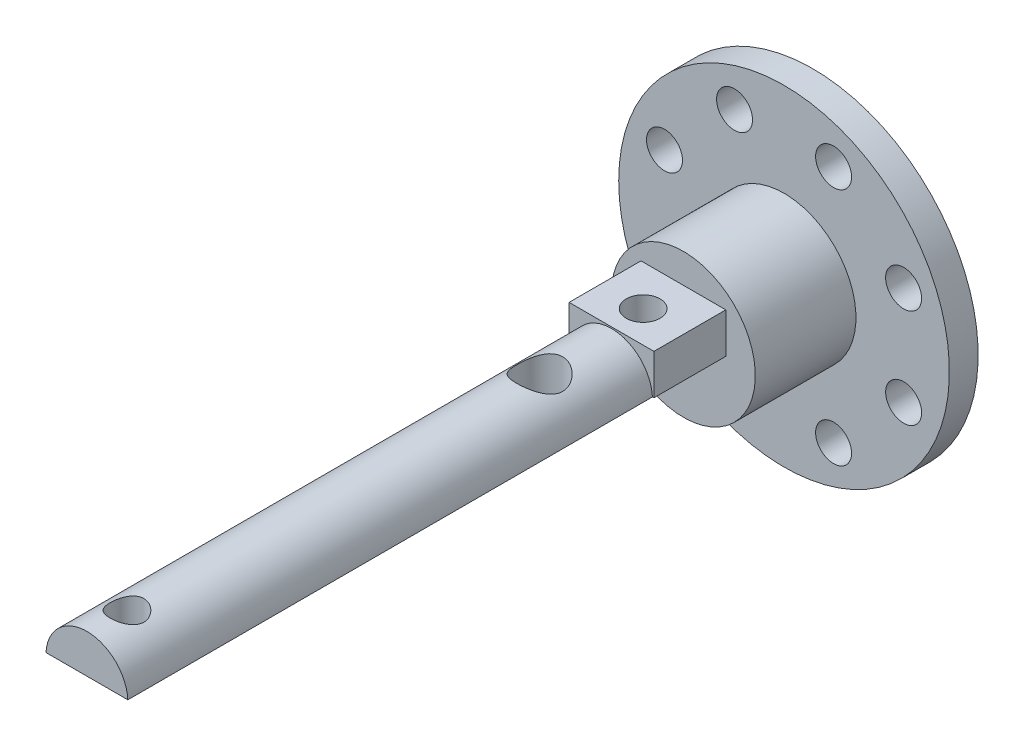
ISO-10303-21;
HEADER;
FILE_DESCRIPTION(('STEP AP214'),'2;1');
FILE_NAME('part.step','',(''),(''),'','','');
FILE_SCHEMA(('AUTOMOTIVE_DESIGN { 1 0 10303 214 1 1 1 1 }'));
ENDSEC;
DATA;
#1=APPLICATION_CONTEXT('core data for automotive mechanical design processes');
#2=APPLICATION_PROTOCOL_DEFINITION('international standard','automotive_design',2000,#1);
#3=PRODUCT_CONTEXT('',#1,'mechanical');
#4=PRODUCT('Part','Part','',(#3));
#5=PRODUCT_RELATED_PRODUCT_CATEGORY('part','',(#4));
#6=PRODUCT_DEFINITION_FORMATION('','',#4);
#7=PRODUCT_DEFINITION_CONTEXT('part definition',#1,'design');
#8=PRODUCT_DEFINITION('design','',#6,#7);
#9=PRODUCT_DEFINITION_SHAPE('','',#8);
#10=(LENGTH_UNIT() NAMED_UNIT(*) SI_UNIT(.MILLI.,.METRE.));
#11=(NAMED_UNIT(*) PLANE_ANGLE_UNIT() SI_UNIT($,.RADIAN.));
#12=(NAMED_UNIT(*) SI_UNIT($,.STERADIAN.) SOLID_ANGLE_UNIT());
#13=UNCERTAINTY_MEASURE_WITH_UNIT(LENGTH_MEASURE(1.E-05),#10,'distance_accuracy_value','');
#14=(GEOMETRIC_REPRESENTATION_CONTEXT(3) GLOBAL_UNCERTAINTY_ASSIGNED_CONTEXT((#13)) GLOBAL_UNIT_ASSIGNED_CONTEXT((#10,
#11,#12)) REPRESENTATION_CONTEXT('',''));
#15=CARTESIAN_POINT('',(0.,0.,0.));
#16=DIRECTION('',(0.,0.,1.));
#17=DIRECTION('',(1.,0.,0.));
#18=AXIS2_PLACEMENT_3D('',#15,#16,#17);
#19=CARTESIAN_POINT('',(0.,-7.05,33.7));
#20=DIRECTION('',(0.,1.,0.));
#21=DIRECTION('',(0.,0.,1.));
#22=AXIS2_PLACEMENT_3D('',#19,#20,#21);
#23=CYLINDRICAL_SURFACE('',#22,1.175);
#24=CARTESIAN_POINT('',(0.,0.149999999999999,33.7));
#25=DIRECTION('',(0.,1.,0.));
#26=DIRECTION('',(0.,0.,1.));
#27=AXIS2_PLACEMENT_3D('',#24,#25,#26);
#28=CIRCLE('',#27,1.175);
#29=CARTESIAN_POINT('',(0.,0.149999999999999,34.875));
#30=VERTEX_POINT('',#29);
#31=EDGE_CURVE('E183',#30,#30,#28,.F.);
#32=ORIENTED_EDGE('',*,*,#31,.T.);
#33=EDGE_LOOP('',(#32));
#34=FACE_BOUND('',#33,.T.);
#35=CARTESIAN_POINT('',(0.,2.85,34.875));
#36=CARTESIAN_POINT('',(-0.0629968161271539,2.84999509484872,34.8749934479398));
#37=CARTESIAN_POINT('',(-0.126095535243504,2.8478869699582,34.86990359386));
#38=CARTESIAN_POINT('',(-0.25050721167985,2.83965823728693,34.8497236303066));
#39=CARTESIAN_POINT('',(-0.311815008849235,2.83352703997777,34.8346071275516));
#40=CARTESIAN_POINT('',(-0.430642131795286,2.81791148857797,34.7950245578328));
#41=CARTESIAN_POINT('',(-0.488173426790336,2.80843840207579,34.7705898860661));
#42=CARTESIAN_POINT('',(-0.598265557059767,2.78706428592466,34.713192811892));
#43=CARTESIAN_POINT('',(-0.650827949020678,2.77516402039013,34.6802330924313));
#44=CARTESIAN_POINT('',(-0.752167833650153,2.74947245917614,34.605001788699));
#45=CARTESIAN_POINT('',(-0.800667710363407,2.73562008285834,34.5623772763286));
#46=CARTESIAN_POINT('',(-0.890068272897995,2.70785416061391,34.4697721769041));
#47=CARTESIAN_POINT('',(-0.930965034580821,2.69394058687308,34.4197878149832));
#48=CARTESIAN_POINT('',(-1.00593385279979,2.66688271317203,34.3109758941936));
#49=CARTESIAN_POINT('',(-1.03958478607056,2.65380726040177,34.2518392852225));
#50=CARTESIAN_POINT('',(-1.09633790583342,2.63087193976299,34.1281271733245));
#51=CARTESIAN_POINT('',(-1.11944541391486,2.62101045042852,34.0635544337177));
#52=CARTESIAN_POINT('',(-1.15331558188665,2.60627927572287,33.9339973769551));
#53=CARTESIAN_POINT('',(-1.16461184513598,2.60119498558851,33.8691778891299));
#54=CARTESIAN_POINT('',(-1.17620424736987,2.59597539996219,33.7383793957889));
#55=CARTESIAN_POINT('',(-1.17650627264394,2.59583745620845,33.6724010296665));
#56=CARTESIAN_POINT('',(-1.16650419004596,2.60034413662782,33.5464214639059));
#57=CARTESIAN_POINT('',(-1.15699125110256,2.60463201294701,33.4863421470061));
#58=CARTESIAN_POINT('',(-1.12895425181415,2.61690542030075,33.3687237668395));
#59=CARTESIAN_POINT('',(-1.11042850776913,2.62489164221716,33.3111851804032));
#60=CARTESIAN_POINT('',(-1.06453257032029,2.64384107143132,33.1988451636227));
#61=CARTESIAN_POINT('',(-1.03698432000385,2.65486343504586,33.1441269035312));
#62=CARTESIAN_POINT('',(-0.973951001686853,2.67862877272763,33.0398800313747));
#63=CARTESIAN_POINT('',(-0.938462841547497,2.69137241636624,32.9903534522363));
#64=CARTESIAN_POINT('',(-0.857115691692508,2.71842505741005,32.8935915831946));
#65=CARTESIAN_POINT('',(-0.810642305194916,2.73277641896415,32.8468832143094));
#66=CARTESIAN_POINT('',(-0.710376894622737,2.76053775310309,32.7617484276844));
#67=CARTESIAN_POINT('',(-0.656583231106344,2.77394751378516,32.7233238701745));
#68=CARTESIAN_POINT('',(-0.541631569122669,2.79868944938511,32.6550967208368));
#69=CARTESIAN_POINT('',(-0.480336750755028,2.80996897714959,32.6255041487763));
#70=CARTESIAN_POINT('',(-0.353055284282163,2.82877713594214,32.5772344369783));
#71=CARTESIAN_POINT('',(-0.287071194971822,2.83630779492746,32.5585513947629));
#72=CARTESIAN_POINT('',(-0.156691247669828,2.84639334404207,32.53372399364));
#73=CARTESIAN_POINT('',(-0.0924517362880305,2.84922850219702,32.5268722376443));
#74=CARTESIAN_POINT('',(0.0363162052930506,2.85049507043982,32.523798325315));
#75=CARTESIAN_POINT('',(0.100844549699847,2.84892771144203,32.5275731978479));
#76=CARTESIAN_POINT('',(0.225074275467903,2.84174762499311,32.5451351920183));
#77=CARTESIAN_POINT('',(0.284858173070616,2.83633420876873,32.5584292642479));
#78=CARTESIAN_POINT('',(0.40128448840533,2.82221757142166,32.593970182156));
#79=CARTESIAN_POINT('',(0.457926506251349,2.81351393262921,32.6162181644913));
#80=CARTESIAN_POINT('',(0.568439215651947,2.79331908503216,32.6697626814667));
#81=CARTESIAN_POINT('',(0.62216977904852,2.78174990304477,32.7013180772378));
#82=CARTESIAN_POINT('',(0.723764641162477,2.75706409818463,32.7722965669164));
#83=CARTESIAN_POINT('',(0.771626500995378,2.74394683638322,32.8117229140244));
#84=CARTESIAN_POINT('',(0.863646399577072,2.71644630181743,32.9005563935136));
#85=CARTESIAN_POINT('',(0.907310360438621,2.70203869862703,32.9504691149012));
#86=CARTESIAN_POINT('',(0.985776061518814,2.6744121569761,33.0571502621323));
#87=CARTESIAN_POINT('',(1.02057594342519,2.66119346814097,33.1139201218708));
#88=CARTESIAN_POINT('',(1.08065777288065,2.6373739959392,33.2337883137651));
#89=CARTESIAN_POINT('',(1.1058103712031,2.62680940397674,33.2969591984874));
#90=CARTESIAN_POINT('',(1.14491258248185,2.61000701171423,33.427210794345));
#91=CARTESIAN_POINT('',(1.15887117226043,2.60376574495405,33.4942883262189));
#92=CARTESIAN_POINT('',(1.17430601630392,2.59683852995258,33.624979296529));
#93=CARTESIAN_POINT('',(1.17664694088522,2.59576792207377,33.6884707428866));
#94=CARTESIAN_POINT('',(1.17107836319572,2.59828501340131,33.8149018698934));
#95=CARTESIAN_POINT('',(1.16317035715606,2.6018720326455,33.8778416297324));
#96=CARTESIAN_POINT('',(1.13804953052432,2.61295183537837,33.9984928691078));
#97=CARTESIAN_POINT('',(1.12126771297327,2.62026316926139,34.0563123219255));
#98=CARTESIAN_POINT('',(1.07929208941009,2.63782931334104,34.168330969104));
#99=CARTESIAN_POINT('',(1.05409593006223,2.64808494689109,34.2225291455659));
#100=CARTESIAN_POINT('',(0.99428158679629,2.67113986379421,34.3292790293512));
#101=CARTESIAN_POINT('',(0.959192614094255,2.6840540588405,34.3815416785063));
#102=CARTESIAN_POINT('',(0.881255588953803,2.71064244892235,34.4797079283668));
#103=CARTESIAN_POINT('',(0.83840493769613,2.7243168974452,34.5256093900613));
#104=CARTESIAN_POINT('',(0.742563018074264,2.75204607368417,34.6130854352394));
#105=CARTESIAN_POINT('',(0.689069115400366,2.76605938071856,34.6541249850735));
#106=CARTESIAN_POINT('',(0.575430726189165,2.7919114852231,34.7266678229023));
#107=CARTESIAN_POINT('',(0.515283214132481,2.80374928688554,34.7581667480616));
#108=CARTESIAN_POINT('',(0.391027984792395,2.82373693156054,34.8100355673459));
#109=CARTESIAN_POINT('',(0.327005882404628,2.8319465449177,34.8305870708869));
#110=CARTESIAN_POINT('',(0.196122442939498,2.8439971598554,34.860446952604));
#111=CARTESIAN_POINT('',(0.129270719730657,2.84785188771485,34.8697906627026));
#112=CARTESIAN_POINT('',(0.0414737361621705,2.84977521425735,34.8744532197877));
#113=CARTESIAN_POINT('',(0.020742391874099,2.8500016150748,34.8750021573376));
#114=CARTESIAN_POINT('',(0.,2.85,34.875));
#115=B_SPLINE_CURVE_WITH_KNOTS('',3,(#35,#36,#37,#38,#39,#40,#41,#42,#43,#44,#45,#46,#47,#48,
#49,#50,#51,#52,#53,#54,#55,#56,#57,#58,#59,#60,#61,#62,#63,#64,#65,#66,#67,#68,#69,#70,#71,#72,
#73,#74,#75,#76,#77,#78,#79,#80,#81,#82,#83,#84,#85,#86,#87,#88,#89,#90,#91,#92,#93,#94,#95,#96,
#97,#98,#99,#100,#101,#102,#103,#104,#105,#106,#107,#108,#109,#110,#111,#112,#113,#114),
.UNSPECIFIED.,.T.,.F.,(4,2,2,2,2,2,2,2,2,2,2,2,2,2,2,2,2,2,2,2,2,2,2,2,2,2,2,2,2,2,2,2,2,2,2,2,
2,2,2,4),(0.,0.188932351290964,0.378364015955843,0.567162998527725,0.755902635677748,
0.953154531547715,1.15050795262185,1.35732169191134,1.56403093019276,1.76093452465857,
1.95773269584519,2.1398193081432,2.32193994947184,2.50789626410869,2.69392512449625,
2.89531557316504,3.09675119949272,3.30265235666812,3.50844200988215,3.70143612609754,
3.89437628781983,4.07798532811624,4.26161768407252,4.45093633010266,4.64033338741745,
4.84299346788706,5.04569600018069,5.2510285092584,5.45619619071234,5.64583768300716,
5.83545149284859,6.01660326056879,6.19780573557783,6.38977224771294,6.58180315462751,
6.78740506049091,6.99310084466375,7.19526871940419,7.3967975823827,7.45900562890147),.UNSPECIFIED.);
#116=CARTESIAN_POINT('',(0.,2.85,34.875));
#117=VERTEX_POINT('',#116);
#118=EDGE_CURVE('E131',#117,#117,#115,.T.);
#119=ORIENTED_EDGE('',*,*,#118,.F.);
#120=EDGE_LOOP('',(#119));
#121=FACE_BOUND('',#120,.T.);
#122=ADVANCED_FACE('F49',(#34,#121),#23,.F.);
#123=CARTESIAN_POINT('',(-7.05,0.149999999999999,36.5));
#124=DIRECTION('',(0.,1.,0.));
#125=DIRECTION('',(0.,0.,1.));
#126=AXIS2_PLACEMENT_3D('',#123,#124,#125);
#127=PLANE('',#126);
#128=CARTESIAN_POINT('',(0.,0.149999999999998,5.));
#129=DIRECTION('',(0.,1.,0.));
#130=DIRECTION('',(0.,0.,1.));
#131=AXIS2_PLACEMENT_3D('',#128,#129,#130);
#132=CIRCLE('',#131,1.6);
#133=CARTESIAN_POINT('',(0.,0.149999999999998,6.6));
#134=VERTEX_POINT('',#133);
#135=EDGE_CURVE('E132',#134,#134,#132,.T.);
#136=ORIENTED_EDGE('',*,*,#135,.T.);
#137=EDGE_LOOP('',(#136));
#138=FACE_BOUND('',#137,.T.);
#139=ORIENTED_EDGE('',*,*,#31,.F.);
#140=EDGE_LOOP('',(#139));
#141=FACE_BOUND('',#140,.T.);
#142=CARTESIAN_POINT('',(0.,0.149999999999999,-2.2));
#143=DIRECTION('',(0.,1.,0.));
#144=DIRECTION('',(0.,0.,1.));
#145=AXIS2_PLACEMENT_3D('',#142,#143,#144);
#146=CIRCLE('',#145,1.175);
#147=CARTESIAN_POINT('',(0.,0.149999999999999,-1.025));
#148=VERTEX_POINT('',#147);
#149=EDGE_CURVE('E186',#148,#148,#146,.F.);
#150=ORIENTED_EDGE('',*,*,#149,.F.);
#151=EDGE_LOOP('',(#150));
#152=FACE_BOUND('',#151,.T.);
#153=DIRECTION('',(-1.,0.,0.));
#154=VECTOR('',#153,1.);
#155=CARTESIAN_POINT('',(-7.05,0.149999999999999,36.4833867717363));
#156=LINE('',#155,#154);
#157=CARTESIAN_POINT('',(2.84604989415154,0.149999999999999,36.4833867717363));
#158=VERTEX_POINT('',#157);
#159=CARTESIAN_POINT('',(-2.84604989415154,0.149999999999999,36.4833867717363));
#160=VERTEX_POINT('',#159);
#161=EDGE_CURVE('E13',#158,#160,#156,.T.);
#162=ORIENTED_EDGE('',*,*,#161,.T.);
#163=DIRECTION('',(0.,0.,-1.));
#164=VECTOR('',#163,1.);
#165=CARTESIAN_POINT('',(-2.84604989415154,0.149999999999999,31.5));
#166=LINE('',#165,#164);
#167=CARTESIAN_POINT('',(-2.84604989415154,0.149999999999999,0.));
#168=VERTEX_POINT('',#167);
#169=EDGE_CURVE('E69',#168,#160,#166,.F.);
#170=ORIENTED_EDGE('',*,*,#169,.F.);
#171=DIRECTION('',(1.,0.,0.));
#172=VECTOR('',#171,1.);
#173=CARTESIAN_POINT('',(0.,0.149999999999998,0.));
#174=LINE('',#173,#172);
#175=CARTESIAN_POINT('',(-2.95,0.149999999999998,0.));
#176=VERTEX_POINT('',#175);
#177=EDGE_CURVE('E193',#176,#168,#174,.T.);
#178=ORIENTED_EDGE('',*,*,#177,.F.);
#179=DIRECTION('',(0.,0.,1.));
#180=VECTOR('',#179,1.);
#181=CARTESIAN_POINT('',(-2.95,0.149999999999998,-5.));
#182=LINE('',#181,#180);
#183=CARTESIAN_POINT('',(-2.95,0.149999999999998,-5.));
#184=VERTEX_POINT('',#183);
#185=EDGE_CURVE('E126',#184,#176,#182,.T.);
#186=ORIENTED_EDGE('',*,*,#185,.F.);
#187=DIRECTION('',(1.,0.,0.));
#188=VECTOR('',#187,1.);
#189=CARTESIAN_POINT('',(-7.05,0.149999999999998,-5.));
#190=LINE('',#189,#188);
#191=CARTESIAN_POINT('',(2.95,0.149999999999998,-5.));
#192=VERTEX_POINT('',#191);
#193=EDGE_CURVE('E276',#184,#192,#190,.T.);
#194=ORIENTED_EDGE('',*,*,#193,.T.);
#195=DIRECTION('',(0.,0.,1.));
#196=VECTOR('',#195,1.);
#197=CARTESIAN_POINT('',(2.95,0.149999999999999,36.5));
#198=LINE('',#197,#196);
#199=CARTESIAN_POINT('',(2.95,0.149999999999998,0.));
#200=VERTEX_POINT('',#199);
#201=EDGE_CURVE('E162',#192,#200,#198,.T.);
#202=ORIENTED_EDGE('',*,*,#201,.T.);
#203=CARTESIAN_POINT('',(2.84604989415154,0.149999999999999,0.));
#204=VERTEX_POINT('',#203);
#205=EDGE_CURVE('E124',#204,#200,#174,.T.);
#206=ORIENTED_EDGE('',*,*,#205,.F.);
#207=DIRECTION('',(0.,0.,-1.));
#208=VECTOR('',#207,1.);
#209=CARTESIAN_POINT('',(2.84604989415154,0.149999999999999,31.5));
#210=LINE('',#209,#208);
#211=EDGE_CURVE('E103',#158,#204,#210,.T.);
#212=ORIENTED_EDGE('',*,*,#211,.F.);
#213=EDGE_LOOP('',(#162,#170,#178,#186,#194,#202,#206,#212));
#214=FACE_BOUND('',#213,.T.);
#215=ADVANCED_FACE('F121',(#138,#141,#152,#214),#127,.F.);
#216=CARTESIAN_POINT('',(-7.05,10.0245516400868,36.4833867717363));
#217=DIRECTION('',(0.,0.,-1.));
#218=DIRECTION('',(-1.,0.,0.));
#219=AXIS2_PLACEMENT_3D('',#216,#217,#218);
#220=PLANE('',#219);
#221=CARTESIAN_POINT('',(0.,0.,36.4833867717363));
#222=DIRECTION('',(0.,0.,1.));
#223=DIRECTION('',(1.,0.,0.));
#224=AXIS2_PLACEMENT_3D('',#221,#222,#223);
#225=CIRCLE('',#224,2.85);
#226=EDGE_CURVE('E128',#158,#160,#225,.T.);
#227=ORIENTED_EDGE('',*,*,#226,.T.);
#228=ORIENTED_EDGE('',*,*,#161,.F.);
#229=EDGE_LOOP('',(#227,#228));
#230=FACE_BOUND('',#229,.T.);
#231=ADVANCED_FACE('F134',(#230),#220,.F.);
#232=CARTESIAN_POINT('',(0.,0.,31.5));
#233=DIRECTION('',(0.,0.,-1.));
#234=DIRECTION('',(-1.,0.,0.));
#235=AXIS2_PLACEMENT_3D('',#232,#233,#234);
#236=CYLINDRICAL_SURFACE('',#235,2.85);
#237=CARTESIAN_POINT('',(-1.6,2.35849528301415,5.));
#238=CARTESIAN_POINT('',(-1.59999395279546,2.35850392266526,4.91833534767746));
#239=CARTESIAN_POINT('',(-1.59370389367939,2.3628045525493,4.83660749323654));
#240=CARTESIAN_POINT('',(-1.56892986038038,2.37932025457799,4.6757986040157));
#241=CARTESIAN_POINT('',(-1.55042635211012,2.3915480047321,4.59672202290983));
#242=CARTESIAN_POINT('',(-1.50236549219922,2.42202261410857,4.44387078469551));
#243=CARTESIAN_POINT('',(-1.47287970525865,2.44023041616355,4.37006541062127));
#244=CARTESIAN_POINT('',(-1.40391160101779,2.48054917434507,4.22848113536161));
#245=CARTESIAN_POINT('',(-1.36442692991239,2.50266104914519,4.16070365826735));
#246=CARTESIAN_POINT('',(-1.27170775473502,2.55113164202025,4.02522311131382));
#247=CARTESIAN_POINT('',(-1.21746124125678,2.57769222298442,3.95828460099886));
#248=CARTESIAN_POINT('',(-1.09884493398845,2.63044810845803,3.83383729828193));
#249=CARTESIAN_POINT('',(-1.03446884217712,2.65664317460508,3.77633441818525));
#250=CARTESIAN_POINT('',(-0.890327427433587,2.70854105472115,3.6672580707115));
#251=CARTESIAN_POINT('',(-0.809696405340586,2.73398445314875,3.61669318504103));
#252=CARTESIAN_POINT('',(-0.63937256329393,2.77874619155293,3.53020338946363));
#253=CARTESIAN_POINT('',(-0.549687008602536,2.79806939160488,3.49426685661889));
#254=CARTESIAN_POINT('',(-0.371956047515903,2.82693187036103,3.44131745188457));
#255=CARTESIAN_POINT('',(-0.28443231383276,2.83716937583075,3.42294347630095));
#256=CARTESIAN_POINT('',(-0.10700074018755,2.84937440750952,3.40108735032623));
#257=CARTESIAN_POINT('',(-0.0170948589965489,2.85134852833935,3.39759332490414));
#258=CARTESIAN_POINT('',(0.152011896477189,2.84706245558497,3.40523769092512));
#259=CARTESIAN_POINT('',(0.231311667103898,2.84167615258975,3.41482300830926));
#260=CARTESIAN_POINT('',(0.386958648802832,2.82469321561151,3.44547289470523));
#261=CARTESIAN_POINT('',(0.463305630867865,2.81309610097271,3.46653835216925));
#262=CARTESIAN_POINT('',(0.611914948355358,2.78457318094157,3.5195105194581));
#263=CARTESIAN_POINT('',(0.684129889519098,2.76759623859293,3.551521510885));
#264=CARTESIAN_POINT('',(0.822293565204663,2.72973842284354,3.62523773086405));
#265=CARTESIAN_POINT('',(0.88824036211806,2.7088563481698,3.66694594337912));
#266=CARTESIAN_POINT('',(1.01980658545479,2.66230832979128,3.76411835896765));
#267=CARTESIAN_POINT('',(1.0845819356862,2.63636871428323,3.82059414397547));
#268=CARTESIAN_POINT('',(1.20424883070273,2.58390462603882,3.94305755058793));
#269=CARTESIAN_POINT('',(1.25912948470413,2.55737954449436,4.00905551090079));
#270=CARTESIAN_POINT('',(1.36260794315987,2.5038969412787,4.15612639719415));
#271=CARTESIAN_POINT('',(1.41013253180311,2.47713251576212,4.23803284137329));
#272=CARTESIAN_POINT('',(1.4904293606678,2.42967303045694,4.41039741872398));
#273=CARTESIAN_POINT('',(1.52321868936041,2.40897094993209,4.5008454980226));
#274=CARTESIAN_POINT('',(1.57026105346503,2.37855305689929,4.68034781523672));
#275=CARTESIAN_POINT('',(1.58578678035343,2.36809104430156,4.76893504719641));
#276=CARTESIAN_POINT('',(1.60167127412481,2.35738365222748,4.94802571025014));
#277=CARTESIAN_POINT('',(1.60204950013798,2.35712516487051,5.03852653342783));
#278=CARTESIAN_POINT('',(1.58879028214847,2.36606776760766,5.20380848675404));
#279=CARTESIAN_POINT('',(1.5773088732353,2.37381376445784,5.27885834717327));
#280=CARTESIAN_POINT('',(1.54415580196972,2.39551095519191,5.42573961132857));
#281=CARTESIAN_POINT('',(1.52247927577777,2.4094651106635,5.49756946094215));
#282=CARTESIAN_POINT('',(1.46873802837105,2.4426086711762,5.63936872825712));
#283=CARTESIAN_POINT('',(1.43629086208308,2.46198592081298,5.70914739168588));
#284=CARTESIAN_POINT('',(1.36224571427759,2.50371574475035,5.84268798511869));
#285=CARTESIAN_POINT('',(1.32064333998896,2.52606974528915,5.90644700577315));
#286=CARTESIAN_POINT('',(1.22142988753454,2.57568824002748,6.03726653404124));
#287=CARTESIAN_POINT('',(1.16230685067616,2.60315083825531,6.10311068284417));
#288=CARTESIAN_POINT('',(1.03369958516154,2.65684495537743,6.22445365307869));
#289=CARTESIAN_POINT('',(0.964208654719605,2.68307566345377,6.27994573035192));
#290=CARTESIAN_POINT('',(0.811765263358193,2.73319016706837,6.38199750990574));
#291=CARTESIAN_POINT('',(0.728269445898546,2.75685319615998,6.42786271821838));
#292=CARTESIAN_POINT('',(0.553052839981453,2.7972635890906,6.50440828760495));
#293=CARTESIAN_POINT('',(0.461340987669005,2.81401835813644,6.53510491545795));
#294=CARTESIAN_POINT('',(0.282512006989496,2.83724505952307,6.57725475076255));
#295=CARTESIAN_POINT('',(0.195903098382138,2.84460241513879,6.59037201567045));
#296=CARTESIAN_POINT('',(0.021415181377881,2.85125334010506,6.60224020312294));
#297=CARTESIAN_POINT('',(-0.0664630638080826,2.85055156879851,6.60099942669233));
#298=CARTESIAN_POINT('',(-0.232076589353777,2.84163070236541,6.58505467445363));
#299=CARTESIAN_POINT('',(-0.309981081749269,2.83413356342065,6.57164354512623));
#300=CARTESIAN_POINT('',(-0.462231416682501,2.81331611390522,6.53378522684001));
#301=CARTESIAN_POINT('',(-0.53657685003378,2.79999513554078,6.50933677226971));
#302=CARTESIAN_POINT('',(-0.682310910428294,2.76815700419426,6.44943304260292));
#303=CARTESIAN_POINT('',(-0.753533618764435,2.74948995489741,6.41365654013345));
#304=CARTESIAN_POINT('',(-0.889179608865057,2.70866845790949,6.3325213960116));
#305=CARTESIAN_POINT('',(-0.953600274958112,2.68651267675434,6.28715908819331));
#306=CARTESIAN_POINT('',(-1.08188371800175,2.63766449859574,6.18202911162553));
#307=CARTESIAN_POINT('',(-1.14478618419834,2.61074516813044,6.12119382663685));
#308=CARTESIAN_POINT('',(-1.25999341856703,2.55713980381404,5.9899752996364));
#309=CARTESIAN_POINT('',(-1.31228448439796,2.53045411364896,5.91957990603254));
#310=CARTESIAN_POINT('',(-1.40858273609629,2.47822805305822,5.76473766877847));
#311=CARTESIAN_POINT('',(-1.45166994978709,2.45292513990978,5.67963196302838));
#312=CARTESIAN_POINT('',(-1.52233864877052,2.40971536338021,5.50158487290599));
#313=CARTESIAN_POINT('',(-1.54996823791529,2.39178560155807,5.40866884415895));
#314=CARTESIAN_POINT('',(-1.57925378187421,2.37246656004371,5.2621195208314));
#315=CARTESIAN_POINT('',(-1.58701194632035,2.36726256867822,5.21014567087497));
#316=CARTESIAN_POINT('',(-1.59738677133886,2.36027429777522,5.10545662191916));
#317=CARTESIAN_POINT('',(-1.60000390546679,2.3584897032673,5.05274149165187));
#318=CARTESIAN_POINT('',(-1.6,2.35849528301415,5.));
#319=B_SPLINE_CURVE_WITH_KNOTS('',3,(#237,#238,#239,#240,#241,#242,#243,#244,#245,#246,#247,
#248,#249,#250,#251,#252,#253,#254,#255,#256,#257,#258,#259,#260,#261,#262,#263,#264,#265,#266,
#267,#268,#269,#270,#271,#272,#273,#274,#275,#276,#277,#278,#279,#280,#281,#282,#283,#284,#285,
#286,#287,#288,#289,#290,#291,#292,#293,#294,#295,#296,#297,#298,#299,#300,#301,#302,#303,#304,
#305,#306,#307,#308,#309,#310,#311,#312,#313,#314,#315,#316,#317,#318),.UNSPECIFIED.,.T.,.F.,(4,
2,2,2,2,2,2,2,2,2,2,2,2,2,2,2,2,2,2,2,2,2,2,2,2,2,2,2,2,2,2,2,2,2,2,2,2,2,2,2,4),(0.,
0.244769298535446,0.489931030707685,0.733522377245182,0.977171120229636,1.24656425493462,
1.51612555033986,1.81009875269897,2.10383792097514,2.37232807214453,2.6406039129828,
2.87964439586771,3.11870338080984,3.36010652969648,3.60158406006175,3.86978816895844,
4.13828570318417,4.43198482842084,4.72534246641959,4.99523944556281,5.26478969231817,
5.49270136074311,5.72072187067809,5.9579053703682,6.1952029224472,6.47199082988447,
6.74895843389895,7.04180483503155,7.33433650254561,7.59656405135887,7.85864000229569,
8.09576814595637,8.33292348718112,8.57751845586202,8.8222071416534,9.09573004505501,
9.36960392795464,9.66409544566947,9.95766533939596,10.1157592863564,10.2738386701313),.UNSPECIFIED.);
#320=CARTESIAN_POINT('',(-1.6,2.35849528301415,5.));
#321=VERTEX_POINT('',#320);
#322=EDGE_CURVE('E54',#321,#321,#319,.T.);
#323=ORIENTED_EDGE('',*,*,#322,.T.);
#324=EDGE_LOOP('',(#323));
#325=FACE_BOUND('',#324,.T.);
#326=ORIENTED_EDGE('',*,*,#211,.T.);
#327=CARTESIAN_POINT('',(0.,0.,0.));
#328=DIRECTION('',(0.,0.,-1.));
#329=DIRECTION('',(-1.,0.,0.));
#330=AXIS2_PLACEMENT_3D('',#327,#328,#329);
#331=CIRCLE('',#330,2.85);
#332=EDGE_CURVE('E62',#168,#204,#331,.T.);
#333=ORIENTED_EDGE('',*,*,#332,.F.);
#334=ORIENTED_EDGE('',*,*,#169,.T.);
#335=ORIENTED_EDGE('',*,*,#226,.F.);
#336=EDGE_LOOP('',(#326,#333,#334,#335));
#337=FACE_BOUND('',#336,.T.);
#338=ORIENTED_EDGE('',*,*,#118,.T.);
#339=EDGE_LOOP('',(#338));
#340=FACE_BOUND('',#339,.T.);
#341=ADVANCED_FACE('F51',(#325,#337,#340),#236,.T.);
#342=CARTESIAN_POINT('',(0.,0.,0.));
#343=DIRECTION('',(0.,0.,-1.));
#344=DIRECTION('',(-1.,0.,0.));
#345=AXIS2_PLACEMENT_3D('',#342,#343,#344);
#346=PLANE('',#345);
#347=DIRECTION('',(0.,1.,0.));
#348=VECTOR('',#347,1.);
#349=CARTESIAN_POINT('',(-2.95,-2.95,0.));
#350=LINE('',#349,#348);
#351=CARTESIAN_POINT('',(-2.95,2.95,0.));
#352=VERTEX_POINT('',#351);
#353=EDGE_CURVE('E90',#176,#352,#350,.T.);
#354=ORIENTED_EDGE('',*,*,#353,.F.);
#355=ORIENTED_EDGE('',*,*,#177,.T.);
#356=ORIENTED_EDGE('',*,*,#332,.T.);
#357=ORIENTED_EDGE('',*,*,#205,.T.);
#358=DIRECTION('',(0.,-1.,0.));
#359=VECTOR('',#358,1.);
#360=CARTESIAN_POINT('',(2.95,-2.95,0.));
#361=LINE('',#360,#359);
#362=CARTESIAN_POINT('',(2.95,2.95,0.));
#363=VERTEX_POINT('',#362);
#364=EDGE_CURVE('E259',#363,#200,#361,.T.);
#365=ORIENTED_EDGE('',*,*,#364,.F.);
#366=DIRECTION('',(1.,0.,0.));
#367=VECTOR('',#366,1.);
#368=CARTESIAN_POINT('',(-2.95,2.95,0.));
#369=LINE('',#368,#367);
#370=EDGE_CURVE('E263',#352,#363,#369,.T.);
#371=ORIENTED_EDGE('',*,*,#370,.F.);
#372=EDGE_LOOP('',(#354,#355,#356,#357,#365,#371));
#373=FACE_BOUND('',#372,.T.);
#374=ADVANCED_FACE('F141',(#373),#346,.F.);
#375=CARTESIAN_POINT('',(2.95,-2.95,-5.));
#376=DIRECTION('',(-1.,0.,0.));
#377=DIRECTION('',(0.,-1.,0.));
#378=AXIS2_PLACEMENT_3D('',#375,#376,#377);
#379=PLANE('',#378);
#380=ORIENTED_EDGE('',*,*,#364,.T.);
#381=ORIENTED_EDGE('',*,*,#201,.F.);
#382=DIRECTION('',(0.,-1.,0.));
#383=VECTOR('',#382,1.);
#384=CARTESIAN_POINT('',(2.95,-2.95,-5.));
#385=LINE('',#384,#383);
#386=CARTESIAN_POINT('',(2.95,2.95,-5.));
#387=VERTEX_POINT('',#386);
#388=EDGE_CURVE('E98',#387,#192,#385,.T.);
#389=ORIENTED_EDGE('',*,*,#388,.F.);
#390=DIRECTION('',(0.,0.,1.));
#391=VECTOR('',#390,1.);
#392=CARTESIAN_POINT('',(2.95,2.95,-5.));
#393=LINE('',#392,#391);
#394=EDGE_CURVE('E267',#387,#363,#393,.T.);
#395=ORIENTED_EDGE('',*,*,#394,.T.);
#396=EDGE_LOOP('',(#380,#381,#389,#395));
#397=FACE_BOUND('',#396,.T.);
#398=ADVANCED_FACE('F286',(#397),#379,.F.);
#399=CARTESIAN_POINT('',(-2.95,-2.95,-5.));
#400=DIRECTION('',(1.,0.,0.));
#401=DIRECTION('',(0.,0.,-1.));
#402=AXIS2_PLACEMENT_3D('',#399,#400,#401);
#403=PLANE('',#402);
#404=DIRECTION('',(0.,1.,0.));
#405=VECTOR('',#404,1.);
#406=CARTESIAN_POINT('',(-2.95,-2.95,-5.));
#407=LINE('',#406,#405);
#408=CARTESIAN_POINT('',(-2.95,2.95,-5.));
#409=VERTEX_POINT('',#408);
#410=EDGE_CURVE('E78',#184,#409,#407,.T.);
#411=ORIENTED_EDGE('',*,*,#410,.F.);
#412=ORIENTED_EDGE('',*,*,#185,.T.);
#413=ORIENTED_EDGE('',*,*,#353,.T.);
#414=DIRECTION('',(0.,0.,1.));
#415=VECTOR('',#414,1.);
#416=CARTESIAN_POINT('',(-2.95,2.95,-5.));
#417=LINE('',#416,#415);
#418=EDGE_CURVE('E273',#409,#352,#417,.T.);
#419=ORIENTED_EDGE('',*,*,#418,.F.);
#420=EDGE_LOOP('',(#411,#412,#413,#419));
#421=FACE_BOUND('',#420,.T.);
#422=ADVANCED_FACE('F279',(#421),#403,.F.);
#423=CARTESIAN_POINT('',(-2.95,2.95,-5.));
#424=DIRECTION('',(0.,-1.,0.));
#425=DIRECTION('',(1.,0.,0.));
#426=AXIS2_PLACEMENT_3D('',#423,#424,#425);
#427=PLANE('',#426);
#428=CARTESIAN_POINT('',(0.,2.95,-2.2));
#429=DIRECTION('',(0.,1.,0.));
#430=DIRECTION('',(-1.,0.,0.));
#431=AXIS2_PLACEMENT_3D('',#428,#429,#430);
#432=CIRCLE('',#431,1.175);
#433=CARTESIAN_POINT('',(-1.175,2.95,-2.2));
#434=VERTEX_POINT('',#433);
#435=EDGE_CURVE('E187',#434,#434,#432,.T.);
#436=ORIENTED_EDGE('',*,*,#435,.F.);
#437=EDGE_LOOP('',(#436));
#438=FACE_BOUND('',#437,.T.);
#439=ORIENTED_EDGE('',*,*,#370,.T.);
#440=ORIENTED_EDGE('',*,*,#394,.F.);
#441=DIRECTION('',(1.,0.,0.));
#442=VECTOR('',#441,1.);
#443=CARTESIAN_POINT('',(-2.95,2.95,-5.));
#444=LINE('',#443,#442);
#445=EDGE_CURVE('E265',#409,#387,#444,.T.);
#446=ORIENTED_EDGE('',*,*,#445,.F.);
#447=ORIENTED_EDGE('',*,*,#418,.T.);
#448=EDGE_LOOP('',(#439,#440,#446,#447));
#449=FACE_BOUND('',#448,.T.);
#450=ADVANCED_FACE('F284',(#438,#449),#427,.F.);
#451=CARTESIAN_POINT('',(0.,0.,-5.));
#452=DIRECTION('',(0.,0.,-1.));
#453=DIRECTION('',(-1.,0.,0.));
#454=AXIS2_PLACEMENT_3D('',#451,#452,#453);
#455=PLANE('',#454);
#456=ORIENTED_EDGE('',*,*,#193,.F.);
#457=ORIENTED_EDGE('',*,*,#410,.T.);
#458=ORIENTED_EDGE('',*,*,#445,.T.);
#459=ORIENTED_EDGE('',*,*,#388,.T.);
#460=EDGE_LOOP('',(#456,#457,#458,#459));
#461=FACE_BOUND('',#460,.T.);
#462=CARTESIAN_POINT('',(0.,0.,-5.));
#463=DIRECTION('',(0.,0.,-1.));
#464=DIRECTION('',(-1.,0.,0.));
#465=AXIS2_PLACEMENT_3D('',#462,#463,#464);
#466=CIRCLE('',#465,5.);
#467=CARTESIAN_POINT('',(-5.,0.,-5.));
#468=VERTEX_POINT('',#467);
#469=EDGE_CURVE('E253',#468,#468,#466,.T.);
#470=ORIENTED_EDGE('',*,*,#469,.F.);
#471=EDGE_LOOP('',(#470));
#472=FACE_BOUND('',#471,.T.);
#473=ADVANCED_FACE('F287',(#461,#472),#455,.F.);
#474=CARTESIAN_POINT('',(0.,0.,-12.));
#475=DIRECTION('',(0.,0.,1.));
#476=DIRECTION('',(1.,0.,0.));
#477=AXIS2_PLACEMENT_3D('',#474,#475,#476);
#478=CYLINDRICAL_SURFACE('',#477,5.);
#479=CARTESIAN_POINT('',(0.,0.,-12.));
#480=DIRECTION('',(0.,0.,-1.));
#481=DIRECTION('',(-1.,0.,0.));
#482=AXIS2_PLACEMENT_3D('',#479,#480,#481);
#483=CIRCLE('',#482,5.);
#484=CARTESIAN_POINT('',(-5.,0.,-12.));
#485=VERTEX_POINT('',#484);
#486=EDGE_CURVE('E256',#485,#485,#483,.T.);
#487=ORIENTED_EDGE('',*,*,#486,.F.);
#488=EDGE_LOOP('',(#487));
#489=FACE_BOUND('',#488,.T.);
#490=ORIENTED_EDGE('',*,*,#469,.T.);
#491=EDGE_LOOP('',(#490));
#492=FACE_BOUND('',#491,.T.);
#493=ADVANCED_FACE('F290',(#489,#492),#478,.T.);
#494=CARTESIAN_POINT('',(0.,0.,-12.));
#495=DIRECTION('',(0.,0.,-1.));
#496=DIRECTION('',(-1.,0.,0.));
#497=AXIS2_PLACEMENT_3D('',#494,#495,#496);
#498=PLANE('',#497);
#499=CARTESIAN_POINT('',(8.31491579260117,3.44415089128538,-12.));
#500=DIRECTION('',(0.,0.,-1.));
#501=DIRECTION('',(-1.,0.,0.));
#502=AXIS2_PLACEMENT_3D('',#499,#500,#501);
#503=CIRCLE('',#502,1.25);
#504=CARTESIAN_POINT('',(7.06491579260117,3.44415089128538,-12.));
#505=VERTEX_POINT('',#504);
#506=EDGE_CURVE('E198',#505,#505,#503,.T.);
#507=ORIENTED_EDGE('',*,*,#506,.T.);
#508=EDGE_LOOP('',(#507));
#509=FACE_BOUND('',#508,.T.);
#510=CARTESIAN_POINT('',(8.31491579260059,-3.44415089128624,-12.));
#511=DIRECTION('',(0.,0.,-1.));
#512=DIRECTION('',(-1.,0.,0.));
#513=AXIS2_PLACEMENT_3D('',#510,#511,#512);
#514=CIRCLE('',#513,1.25);
#515=CARTESIAN_POINT('',(7.06491579260058,-3.44415089128624,-12.));
#516=VERTEX_POINT('',#515);
#517=EDGE_CURVE('E204',#516,#516,#514,.T.);
#518=ORIENTED_EDGE('',*,*,#517,.T.);
#519=EDGE_LOOP('',(#518));
#520=FACE_BOUND('',#519,.T.);
#521=CARTESIAN_POINT('',(3.44415089128439,-8.3149157926016,-12.));
#522=DIRECTION('',(0.,0.,-1.));
#523=DIRECTION('',(-1.,0.,0.));
#524=AXIS2_PLACEMENT_3D('',#521,#522,#523);
#525=CIRCLE('',#524,1.25);
#526=CARTESIAN_POINT('',(2.19415089128439,-8.3149157926016,-12.));
#527=VERTEX_POINT('',#526);
#528=EDGE_CURVE('E210',#527,#527,#525,.T.);
#529=ORIENTED_EDGE('',*,*,#528,.T.);
#530=EDGE_LOOP('',(#529));
#531=FACE_BOUND('',#530,.T.);
#532=CARTESIAN_POINT('',(-3.44415089128723,-8.31491579260101,-12.));
#533=DIRECTION('',(0.,0.,-1.));
#534=DIRECTION('',(-1.,0.,0.));
#535=AXIS2_PLACEMENT_3D('',#532,#533,#534);
#536=CIRCLE('',#535,1.25);
#537=CARTESIAN_POINT('',(-4.69415089128723,-8.31491579260101,-12.));
#538=VERTEX_POINT('',#537);
#539=EDGE_CURVE('E216',#538,#538,#536,.T.);
#540=ORIENTED_EDGE('',*,*,#539,.T.);
#541=EDGE_LOOP('',(#540));
#542=FACE_BOUND('',#541,.T.);
#543=CARTESIAN_POINT('',(-8.31491579260259,-3.44415089128481,-12.));
#544=DIRECTION('',(0.,0.,-1.));
#545=DIRECTION('',(-1.,0.,0.));
#546=AXIS2_PLACEMENT_3D('',#543,#544,#545);
#547=CIRCLE('',#546,1.25);
#548=CARTESIAN_POINT('',(-9.56491579260259,-3.44415089128481,-12.));
#549=VERTEX_POINT('',#548);
#550=EDGE_CURVE('E222',#549,#549,#547,.T.);
#551=ORIENTED_EDGE('',*,*,#550,.T.);
#552=EDGE_LOOP('',(#551));
#553=FACE_BOUND('',#552,.T.);
#554=CARTESIAN_POINT('',(-8.314915792602,3.44415089128681,-12.));
#555=DIRECTION('',(0.,0.,-1.));
#556=DIRECTION('',(-1.,0.,0.));
#557=AXIS2_PLACEMENT_3D('',#554,#555,#556);
#558=CIRCLE('',#557,1.25);
#559=CARTESIAN_POINT('',(-9.564915792602,3.44415089128681,-12.));
#560=VERTEX_POINT('',#559);
#561=EDGE_CURVE('E228',#560,#560,#558,.T.);
#562=ORIENTED_EDGE('',*,*,#561,.T.);
#563=EDGE_LOOP('',(#562));
#564=FACE_BOUND('',#563,.T.);
#565=CARTESIAN_POINT('',(-3.44415089128581,8.31491579260217,-12.));
#566=DIRECTION('',(0.,0.,-1.));
#567=DIRECTION('',(-1.,0.,0.));
#568=AXIS2_PLACEMENT_3D('',#565,#566,#567);
#569=CIRCLE('',#568,1.25);
#570=CARTESIAN_POINT('',(-4.69415089128581,8.31491579260217,-12.));
#571=VERTEX_POINT('',#570);
#572=EDGE_CURVE('E234',#571,#571,#569,.T.);
#573=ORIENTED_EDGE('',*,*,#572,.T.);
#574=EDGE_LOOP('',(#573));
#575=FACE_BOUND('',#574,.T.);
#576=CARTESIAN_POINT('',(3.44415089128581,8.31491579260158,-12.));
#577=DIRECTION('',(0.,0.,-1.));
#578=DIRECTION('',(-1.,0.,0.));
#579=AXIS2_PLACEMENT_3D('',#576,#577,#578);
#580=CIRCLE('',#579,1.25);
#581=CARTESIAN_POINT('',(2.19415089128581,8.31491579260158,-12.));
#582=VERTEX_POINT('',#581);
#583=EDGE_CURVE('E240',#582,#582,#580,.T.);
#584=ORIENTED_EDGE('',*,*,#583,.T.);
#585=EDGE_LOOP('',(#584));
#586=FACE_BOUND('',#585,.T.);
#587=CARTESIAN_POINT('',(0.,0.,-12.));
#588=DIRECTION('',(0.,0.,-1.));
#589=DIRECTION('',(-1.,0.,0.));
#590=AXIS2_PLACEMENT_3D('',#587,#588,#589);
#591=CIRCLE('',#590,11.5);
#592=CARTESIAN_POINT('',(-11.5,0.,-12.));
#593=VERTEX_POINT('',#592);
#594=EDGE_CURVE('E247',#593,#593,#591,.T.);
#595=ORIENTED_EDGE('',*,*,#594,.F.);
#596=EDGE_LOOP('',(#595));
#597=FACE_BOUND('',#596,.T.);
#598=ORIENTED_EDGE('',*,*,#486,.T.);
#599=EDGE_LOOP('',(#598));
#600=FACE_BOUND('',#599,.T.);
#601=ADVANCED_FACE('F295',(#509,#520,#531,#542,#553,#564,#575,#586,#597,#600),#498,.F.);
#602=CARTESIAN_POINT('',(0.,0.,-14.));
#603=DIRECTION('',(0.,0.,1.));
#604=DIRECTION('',(1.,0.,0.));
#605=AXIS2_PLACEMENT_3D('',#602,#603,#604);
#606=CYLINDRICAL_SURFACE('',#605,11.5);
#607=CARTESIAN_POINT('',(0.,0.,-14.));
#608=DIRECTION('',(0.,0.,-1.));
#609=DIRECTION('',(-1.,0.,0.));
#610=AXIS2_PLACEMENT_3D('',#607,#608,#609);
#611=CIRCLE('',#610,11.5);
#612=CARTESIAN_POINT('',(-11.5,0.,-14.));
#613=VERTEX_POINT('',#612);
#614=EDGE_CURVE('E250',#613,#613,#611,.T.);
#615=ORIENTED_EDGE('',*,*,#614,.F.);
#616=EDGE_LOOP('',(#615));
#617=FACE_BOUND('',#616,.T.);
#618=ORIENTED_EDGE('',*,*,#594,.T.);
#619=EDGE_LOOP('',(#618));
#620=FACE_BOUND('',#619,.T.);
#621=ADVANCED_FACE('F301',(#617,#620),#606,.T.);
#622=CARTESIAN_POINT('',(0.,0.,-14.));
#623=DIRECTION('',(0.,0.,-1.));
#624=DIRECTION('',(-1.,0.,0.));
#625=AXIS2_PLACEMENT_3D('',#622,#623,#624);
#626=PLANE('',#625);
#627=CARTESIAN_POINT('',(8.31491579260117,3.44415089128538,-14.));
#628=DIRECTION('',(0.,0.,-1.));
#629=DIRECTION('',(-1.,0.,0.));
#630=AXIS2_PLACEMENT_3D('',#627,#628,#629);
#631=CIRCLE('',#630,1.25);
#632=CARTESIAN_POINT('',(7.06491579260117,3.44415089128538,-14.));
#633=VERTEX_POINT('',#632);
#634=EDGE_CURVE('E190',#633,#633,#631,.T.);
#635=ORIENTED_EDGE('',*,*,#634,.F.);
#636=EDGE_LOOP('',(#635));
#637=FACE_BOUND('',#636,.T.);
#638=CARTESIAN_POINT('',(8.31491579260059,-3.44415089128624,-14.));
#639=DIRECTION('',(0.,0.,-1.));
#640=DIRECTION('',(-1.,0.,0.));
#641=AXIS2_PLACEMENT_3D('',#638,#639,#640);
#642=CIRCLE('',#641,1.25);
#643=CARTESIAN_POINT('',(7.06491579260058,-3.44415089128624,-14.));
#644=VERTEX_POINT('',#643);
#645=EDGE_CURVE('E201',#644,#644,#642,.T.);
#646=ORIENTED_EDGE('',*,*,#645,.F.);
#647=EDGE_LOOP('',(#646));
#648=FACE_BOUND('',#647,.T.);
#649=CARTESIAN_POINT('',(3.44415089128439,-8.3149157926016,-14.));
#650=DIRECTION('',(0.,0.,-1.));
#651=DIRECTION('',(-1.,0.,0.));
#652=AXIS2_PLACEMENT_3D('',#649,#650,#651);
#653=CIRCLE('',#652,1.25);
#654=CARTESIAN_POINT('',(2.19415089128439,-8.3149157926016,-14.));
#655=VERTEX_POINT('',#654);
#656=EDGE_CURVE('E207',#655,#655,#653,.T.);
#657=ORIENTED_EDGE('',*,*,#656,.F.);
#658=EDGE_LOOP('',(#657));
#659=FACE_BOUND('',#658,.T.);
#660=CARTESIAN_POINT('',(-3.44415089128723,-8.31491579260101,-14.));
#661=DIRECTION('',(0.,0.,-1.));
#662=DIRECTION('',(-1.,0.,0.));
#663=AXIS2_PLACEMENT_3D('',#660,#661,#662);
#664=CIRCLE('',#663,1.25);
#665=CARTESIAN_POINT('',(-4.69415089128723,-8.31491579260101,-14.));
#666=VERTEX_POINT('',#665);
#667=EDGE_CURVE('E213',#666,#666,#664,.T.);
#668=ORIENTED_EDGE('',*,*,#667,.F.);
#669=EDGE_LOOP('',(#668));
#670=FACE_BOUND('',#669,.T.);
#671=CARTESIAN_POINT('',(-8.31491579260259,-3.44415089128481,-14.));
#672=DIRECTION('',(0.,0.,-1.));
#673=DIRECTION('',(-1.,0.,0.));
#674=AXIS2_PLACEMENT_3D('',#671,#672,#673);
#675=CIRCLE('',#674,1.25);
#676=CARTESIAN_POINT('',(-9.56491579260259,-3.44415089128481,-14.));
#677=VERTEX_POINT('',#676);
#678=EDGE_CURVE('E219',#677,#677,#675,.T.);
#679=ORIENTED_EDGE('',*,*,#678,.F.);
#680=EDGE_LOOP('',(#679));
#681=FACE_BOUND('',#680,.T.);
#682=CARTESIAN_POINT('',(-8.314915792602,3.44415089128681,-14.));
#683=DIRECTION('',(0.,0.,-1.));
#684=DIRECTION('',(-1.,0.,0.));
#685=AXIS2_PLACEMENT_3D('',#682,#683,#684);
#686=CIRCLE('',#685,1.25);
#687=CARTESIAN_POINT('',(-9.564915792602,3.44415089128681,-14.));
#688=VERTEX_POINT('',#687);
#689=EDGE_CURVE('E225',#688,#688,#686,.T.);
#690=ORIENTED_EDGE('',*,*,#689,.F.);
#691=EDGE_LOOP('',(#690));
#692=FACE_BOUND('',#691,.T.);
#693=CARTESIAN_POINT('',(-3.44415089128581,8.31491579260217,-14.));
#694=DIRECTION('',(0.,0.,-1.));
#695=DIRECTION('',(-1.,0.,0.));
#696=AXIS2_PLACEMENT_3D('',#693,#694,#695);
#697=CIRCLE('',#696,1.25);
#698=CARTESIAN_POINT('',(-4.69415089128581,8.31491579260217,-14.));
#699=VERTEX_POINT('',#698);
#700=EDGE_CURVE('E231',#699,#699,#697,.T.);
#701=ORIENTED_EDGE('',*,*,#700,.F.);
#702=EDGE_LOOP('',(#701));
#703=FACE_BOUND('',#702,.T.);
#704=CARTESIAN_POINT('',(3.44415089128581,8.31491579260158,-14.));
#705=DIRECTION('',(0.,0.,-1.));
#706=DIRECTION('',(-1.,0.,0.));
#707=AXIS2_PLACEMENT_3D('',#704,#705,#706);
#708=CIRCLE('',#707,1.25);
#709=CARTESIAN_POINT('',(2.19415089128581,8.31491579260158,-14.));
#710=VERTEX_POINT('',#709);
#711=EDGE_CURVE('E237',#710,#710,#708,.T.);
#712=ORIENTED_EDGE('',*,*,#711,.F.);
#713=EDGE_LOOP('',(#712));
#714=FACE_BOUND('',#713,.T.);
#715=CARTESIAN_POINT('',(0.,0.,-14.));
#716=DIRECTION('',(0.,0.,-1.));
#717=DIRECTION('',(-1.,0.,0.));
#718=AXIS2_PLACEMENT_3D('',#715,#716,#717);
#719=CIRCLE('',#718,4.5);
#720=CARTESIAN_POINT('',(-4.5,0.,-14.));
#721=VERTEX_POINT('',#720);
#722=EDGE_CURVE('E243',#721,#721,#719,.T.);
#723=ORIENTED_EDGE('',*,*,#722,.F.);
#724=EDGE_LOOP('',(#723));
#725=FACE_BOUND('',#724,.T.);
#726=ORIENTED_EDGE('',*,*,#614,.T.);
#727=EDGE_LOOP('',(#726));
#728=FACE_BOUND('',#727,.T.);
#729=ADVANCED_FACE('F462',(#637,#648,#659,#670,#681,#692,#703,#714,#725,#728),#626,.T.);
#730=CARTESIAN_POINT('',(0.,0.,-6.5));
#731=DIRECTION('',(0.,0.,-1.));
#732=DIRECTION('',(-1.,0.,0.));
#733=AXIS2_PLACEMENT_3D('',#730,#731,#732);
#734=CYLINDRICAL_SURFACE('',#733,4.5);
#735=CARTESIAN_POINT('',(0.,0.,-6.5));
#736=DIRECTION('',(0.,0.,-1.));
#737=DIRECTION('',(-1.,0.,0.));
#738=AXIS2_PLACEMENT_3D('',#735,#736,#737);
#739=CIRCLE('',#738,4.5);
#740=CARTESIAN_POINT('',(-4.5,0.,-6.5));
#741=VERTEX_POINT('',#740);
#742=EDGE_CURVE('E244',#741,#741,#739,.T.);
#743=ORIENTED_EDGE('',*,*,#742,.F.);
#744=EDGE_LOOP('',(#743));
#745=FACE_BOUND('',#744,.T.);
#746=ORIENTED_EDGE('',*,*,#722,.T.);
#747=EDGE_LOOP('',(#746));
#748=FACE_BOUND('',#747,.T.);
#749=ADVANCED_FACE('F453',(#745,#748),#734,.F.);
#750=CARTESIAN_POINT('',(0.,0.,-6.5));
#751=DIRECTION('',(0.,0.,-1.));
#752=DIRECTION('',(-1.,0.,0.));
#753=AXIS2_PLACEMENT_3D('',#750,#751,#752);
#754=PLANE('',#753);
#755=ORIENTED_EDGE('',*,*,#742,.T.);
#756=EDGE_LOOP('',(#755));
#757=FACE_BOUND('',#756,.T.);
#758=ADVANCED_FACE('F444',(#757),#754,.T.);
#759=CARTESIAN_POINT('',(3.44415089128581,8.31491579260158,-8.5));
#760=DIRECTION('',(0.,0.,-1.));
#761=DIRECTION('',(-1.,0.,0.));
#762=AXIS2_PLACEMENT_3D('',#759,#760,#761);
#763=CYLINDRICAL_SURFACE('',#762,1.25);
#764=ORIENTED_EDGE('',*,*,#711,.T.);
#765=EDGE_LOOP('',(#764));
#766=FACE_BOUND('',#765,.T.);
#767=ORIENTED_EDGE('',*,*,#583,.F.);
#768=EDGE_LOOP('',(#767));
#769=FACE_BOUND('',#768,.T.);
#770=ADVANCED_FACE('F436',(#766,#769),#763,.F.);
#771=CARTESIAN_POINT('',(-3.44415089128581,8.31491579260217,-8.5));
#772=DIRECTION('',(0.,0.,-1.));
#773=DIRECTION('',(-1.,0.,0.));
#774=AXIS2_PLACEMENT_3D('',#771,#772,#773);
#775=CYLINDRICAL_SURFACE('',#774,1.25);
#776=ORIENTED_EDGE('',*,*,#700,.T.);
#777=EDGE_LOOP('',(#776));
#778=FACE_BOUND('',#777,.T.);
#779=ORIENTED_EDGE('',*,*,#572,.F.);
#780=EDGE_LOOP('',(#779));
#781=FACE_BOUND('',#780,.T.);
#782=ADVANCED_FACE('F428',(#778,#781),#775,.F.);
#783=CARTESIAN_POINT('',(-8.314915792602,3.44415089128681,-8.5));
#784=DIRECTION('',(0.,0.,-1.));
#785=DIRECTION('',(-1.,0.,0.));
#786=AXIS2_PLACEMENT_3D('',#783,#784,#785);
#787=CYLINDRICAL_SURFACE('',#786,1.25);
#788=ORIENTED_EDGE('',*,*,#689,.T.);
#789=EDGE_LOOP('',(#788));
#790=FACE_BOUND('',#789,.T.);
#791=ORIENTED_EDGE('',*,*,#561,.F.);
#792=EDGE_LOOP('',(#791));
#793=FACE_BOUND('',#792,.T.);
#794=ADVANCED_FACE('F420',(#790,#793),#787,.F.);
#795=CARTESIAN_POINT('',(-8.31491579260259,-3.44415089128481,-8.5));
#796=DIRECTION('',(0.,0.,-1.));
#797=DIRECTION('',(-1.,0.,0.));
#798=AXIS2_PLACEMENT_3D('',#795,#796,#797);
#799=CYLINDRICAL_SURFACE('',#798,1.25);
#800=ORIENTED_EDGE('',*,*,#678,.T.);
#801=EDGE_LOOP('',(#800));
#802=FACE_BOUND('',#801,.T.);
#803=ORIENTED_EDGE('',*,*,#550,.F.);
#804=EDGE_LOOP('',(#803));
#805=FACE_BOUND('',#804,.T.);
#806=ADVANCED_FACE('F412',(#802,#805),#799,.F.);
#807=CARTESIAN_POINT('',(-3.44415089128723,-8.31491579260101,-8.5));
#808=DIRECTION('',(0.,0.,-1.));
#809=DIRECTION('',(-1.,0.,0.));
#810=AXIS2_PLACEMENT_3D('',#807,#808,#809);
#811=CYLINDRICAL_SURFACE('',#810,1.25);
#812=ORIENTED_EDGE('',*,*,#667,.T.);
#813=EDGE_LOOP('',(#812));
#814=FACE_BOUND('',#813,.T.);
#815=ORIENTED_EDGE('',*,*,#539,.F.);
#816=EDGE_LOOP('',(#815));
#817=FACE_BOUND('',#816,.T.);
#818=ADVANCED_FACE('F404',(#814,#817),#811,.F.);
#819=CARTESIAN_POINT('',(3.44415089128439,-8.3149157926016,-8.5));
#820=DIRECTION('',(0.,0.,-1.));
#821=DIRECTION('',(-1.,0.,0.));
#822=AXIS2_PLACEMENT_3D('',#819,#820,#821);
#823=CYLINDRICAL_SURFACE('',#822,1.25);
#824=ORIENTED_EDGE('',*,*,#656,.T.);
#825=EDGE_LOOP('',(#824));
#826=FACE_BOUND('',#825,.T.);
#827=ORIENTED_EDGE('',*,*,#528,.F.);
#828=EDGE_LOOP('',(#827));
#829=FACE_BOUND('',#828,.T.);
#830=ADVANCED_FACE('F396',(#826,#829),#823,.F.);
#831=CARTESIAN_POINT('',(8.31491579260059,-3.44415089128624,-8.5));
#832=DIRECTION('',(0.,0.,-1.));
#833=DIRECTION('',(-1.,0.,0.));
#834=AXIS2_PLACEMENT_3D('',#831,#832,#833);
#835=CYLINDRICAL_SURFACE('',#834,1.25);
#836=ORIENTED_EDGE('',*,*,#645,.T.);
#837=EDGE_LOOP('',(#836));
#838=FACE_BOUND('',#837,.T.);
#839=ORIENTED_EDGE('',*,*,#517,.F.);
#840=EDGE_LOOP('',(#839));
#841=FACE_BOUND('',#840,.T.);
#842=ADVANCED_FACE('F390',(#838,#841),#835,.F.);
#843=CARTESIAN_POINT('',(8.31491579260117,3.44415089128538,-8.5));
#844=DIRECTION('',(0.,0.,-1.));
#845=DIRECTION('',(-1.,0.,0.));
#846=AXIS2_PLACEMENT_3D('',#843,#844,#845);
#847=CYLINDRICAL_SURFACE('',#846,1.25);
#848=ORIENTED_EDGE('',*,*,#634,.T.);
#849=EDGE_LOOP('',(#848));
#850=FACE_BOUND('',#849,.T.);
#851=ORIENTED_EDGE('',*,*,#506,.F.);
#852=EDGE_LOOP('',(#851));
#853=FACE_BOUND('',#852,.T.);
#854=ADVANCED_FACE('F173',(#850,#853),#847,.F.);
#855=CARTESIAN_POINT('',(0.,-7.05,-2.2));
#856=DIRECTION('',(0.,1.,0.));
#857=DIRECTION('',(-1.,0.,0.));
#858=AXIS2_PLACEMENT_3D('',#855,#856,#857);
#859=CYLINDRICAL_SURFACE('',#858,1.175);
#860=ORIENTED_EDGE('',*,*,#149,.T.);
#861=EDGE_LOOP('',(#860));
#862=FACE_BOUND('',#861,.T.);
#863=ORIENTED_EDGE('',*,*,#435,.T.);
#864=EDGE_LOOP('',(#863));
#865=FACE_BOUND('',#864,.T.);
#866=ADVANCED_FACE('F155',(#862,#865),#859,.F.);
#867=CARTESIAN_POINT('',(0.,-0.0499999999999993,5.));
#868=DIRECTION('',(0.,1.,0.));
#869=DIRECTION('',(-1.,0.,0.));
#870=AXIS2_PLACEMENT_3D('',#867,#868,#869);
#871=CYLINDRICAL_SURFACE('',#870,1.6);
#872=ORIENTED_EDGE('',*,*,#322,.F.);
#873=EDGE_LOOP('',(#872));
#874=FACE_BOUND('',#873,.T.);
#875=ORIENTED_EDGE('',*,*,#135,.F.);
#876=EDGE_LOOP('',(#875));
#877=FACE_BOUND('',#876,.T.);
#878=ADVANCED_FACE('F166',(#874,#877),#871,.F.);
#879=CLOSED_SHELL('',(#122,#215,#231,#341,#374,#398,#422,#450,#473,#493,#601,#621,#729,#749,
#758,#770,#782,#794,#806,#818,#830,#842,#854,#866,#878));
#880=MANIFOLD_SOLID_BREP('B2',#879);
#881=ADVANCED_BREP_SHAPE_REPRESENTATION('',(#18,#880),#14);
#882=SHAPE_DEFINITION_REPRESENTATION(#9,#881);
ENDSEC;
END-ISO-10303-21;
